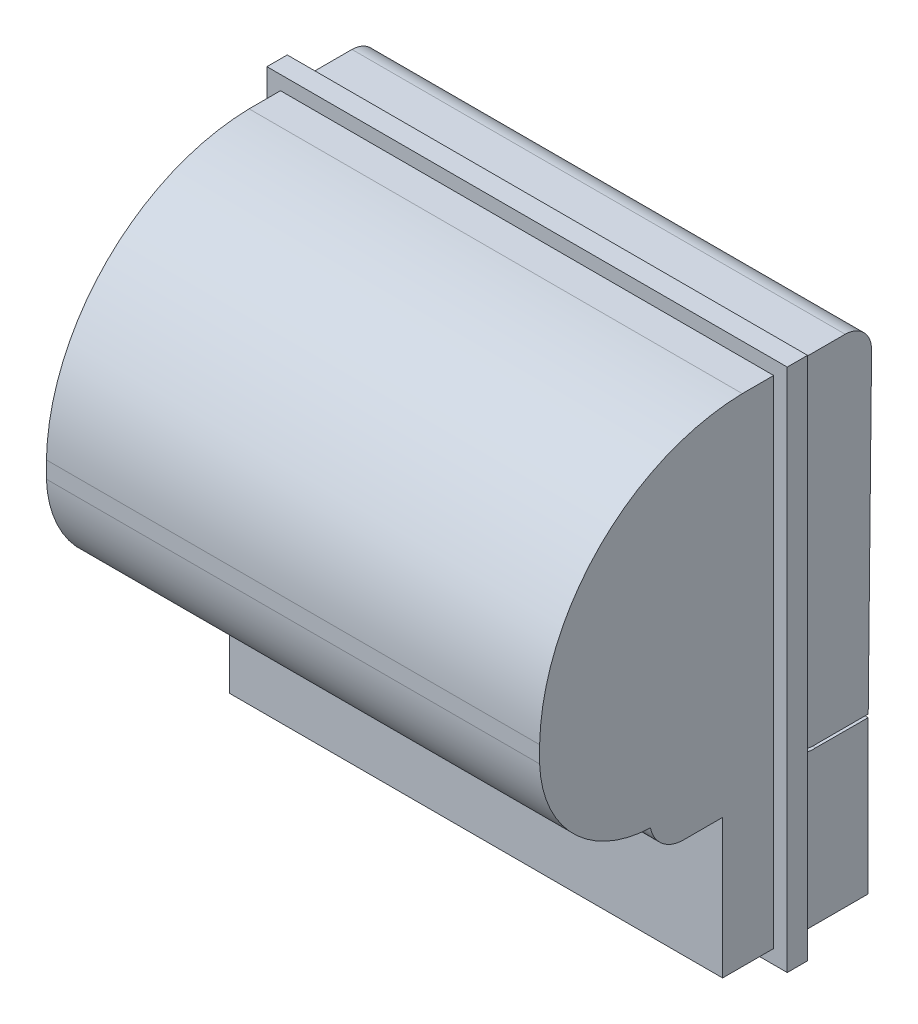
ISO-10303-21;
HEADER;
FILE_DESCRIPTION(('STEP AP214'),'2;1');
FILE_NAME('part.step','',(''),(''),'','','');
FILE_SCHEMA(('AUTOMOTIVE_DESIGN { 1 0 10303 214 1 1 1 1 }'));
ENDSEC;
DATA;
#1=APPLICATION_CONTEXT('core data for automotive mechanical design processes');
#2=APPLICATION_PROTOCOL_DEFINITION('international standard','automotive_design',2000,#1);
#3=PRODUCT_CONTEXT('',#1,'mechanical');
#4=PRODUCT('Part','Part','',(#3));
#5=PRODUCT_RELATED_PRODUCT_CATEGORY('part','',(#4));
#6=PRODUCT_DEFINITION_FORMATION('','',#4);
#7=PRODUCT_DEFINITION_CONTEXT('part definition',#1,'design');
#8=PRODUCT_DEFINITION('design','',#6,#7);
#9=PRODUCT_DEFINITION_SHAPE('','',#8);
#10=(LENGTH_UNIT() NAMED_UNIT(*) SI_UNIT(.MILLI.,.METRE.));
#11=(NAMED_UNIT(*) PLANE_ANGLE_UNIT() SI_UNIT($,.RADIAN.));
#12=(NAMED_UNIT(*) SI_UNIT($,.STERADIAN.) SOLID_ANGLE_UNIT());
#13=UNCERTAINTY_MEASURE_WITH_UNIT(LENGTH_MEASURE(1.E-05),#10,'distance_accuracy_value','');
#14=(GEOMETRIC_REPRESENTATION_CONTEXT(3) GLOBAL_UNCERTAINTY_ASSIGNED_CONTEXT((#13)) GLOBAL_UNIT_ASSIGNED_CONTEXT((#10,
#11,#12)) REPRESENTATION_CONTEXT('',''));
#15=CARTESIAN_POINT('',(0.,0.,0.));
#16=DIRECTION('',(0.,0.,1.));
#17=DIRECTION('',(1.,0.,0.));
#18=AXIS2_PLACEMENT_3D('',#15,#16,#17);
#19=CARTESIAN_POINT('',(2.,75.325,3.));
#20=DIRECTION('',(1.,0.,0.));
#21=DIRECTION('',(0.,1.,0.));
#22=AXIS2_PLACEMENT_3D('',#19,#20,#21);
#23=PLANE('',#22);
#24=DIRECTION('',(0.,0.,1.));
#25=VECTOR('',#24,1.);
#26=CARTESIAN_POINT('',(1.99999999999999,25.0692746241975,3.));
#27=LINE('',#26,#25);
#28=CARTESIAN_POINT('',(2.,25.0692746241975,-10.95));
#29=VERTEX_POINT('',#28);
#30=CARTESIAN_POINT('',(1.99999999999999,25.0692746241975,-3.15989359439703));
#31=VERTEX_POINT('',#30);
#32=EDGE_CURVE('E422',#29,#31,#27,.T.);
#33=ORIENTED_EDGE('',*,*,#32,.T.);
#34=CARTESIAN_POINT('',(1.99999999999999,27.9292641597328,-2.85998953553529));
#35=DIRECTION('',(1.,0.,0.));
#36=DIRECTION('',(0.,1.,0.));
#37=AXIS2_PLACEMENT_3D('',#34,#35,#36);
#38=CIRCLE('',#37,2.87567080659333);
#39=CARTESIAN_POINT('',(1.99999999999999,27.6293601008711,0.));
#40=VERTEX_POINT('',#39);
#41=EDGE_CURVE('E429',#31,#40,#38,.F.);
#42=ORIENTED_EDGE('',*,*,#41,.T.);
#43=DIRECTION('',(0.,-1.,0.));
#44=VECTOR('',#43,1.);
#45=CARTESIAN_POINT('',(2.,75.325,0.));
#46=LINE('',#45,#44);
#47=CARTESIAN_POINT('',(2.,75.325,0.));
#48=VERTEX_POINT('',#47);
#49=EDGE_CURVE('E335',#48,#40,#46,.T.);
#50=ORIENTED_EDGE('',*,*,#49,.F.);
#51=DIRECTION('',(0.,0.,1.));
#52=VECTOR('',#51,1.);
#53=CARTESIAN_POINT('',(2.,75.325,3.));
#54=LINE('',#53,#52);
#55=CARTESIAN_POINT('',(2.,75.325,-7.55257920179949));
#56=VERTEX_POINT('',#55);
#57=EDGE_CURVE('E313',#56,#48,#54,.T.);
#58=ORIENTED_EDGE('',*,*,#57,.F.);
#59=CARTESIAN_POINT('',(2.,71.3761728785547,-7.50117287855473));
#60=DIRECTION('',(1.,0.,0.));
#61=DIRECTION('',(0.,1.,0.));
#62=AXIS2_PLACEMENT_3D('',#59,#60,#61);
#63=CIRCLE('',#62,3.94916171422891);
#64=CARTESIAN_POINT('',(2.,71.4275792017999,-11.45));
#65=VERTEX_POINT('',#64);
#66=EDGE_CURVE('E123',#56,#65,#63,.F.);
#67=ORIENTED_EDGE('',*,*,#66,.T.);
#68=DIRECTION('',(0.,-0.999941840985945,0.0107849267795385));
#69=VECTOR('',#68,1.);
#70=CARTESIAN_POINT('',(2.,75.1687135445449,-11.4903502066872));
#71=LINE('',#70,#69);
#72=EDGE_CURVE('E275',#65,#29,#71,.T.);
#73=ORIENTED_EDGE('',*,*,#72,.T.);
#74=EDGE_LOOP('',(#33,#42,#50,#58,#67,#73));
#75=FACE_BOUND('',#74,.T.);
#76=ADVANCED_FACE('F108',(#75),#23,.F.);
#77=CARTESIAN_POINT('',(74.8,75.325,3.));
#78=DIRECTION('',(-1.,0.,0.));
#79=DIRECTION('',(0.,0.,1.));
#80=AXIS2_PLACEMENT_3D('',#77,#78,#79);
#81=PLANE('',#80);
#82=DIRECTION('',(0.,1.,0.));
#83=VECTOR('',#82,1.);
#84=CARTESIAN_POINT('',(74.8,75.325,0.));
#85=LINE('',#84,#83);
#86=CARTESIAN_POINT('',(74.8,27.6293601008711,0.));
#87=VERTEX_POINT('',#86);
#88=CARTESIAN_POINT('',(74.8,75.325,0.));
#89=VERTEX_POINT('',#88);
#90=EDGE_CURVE('E341',#87,#89,#85,.T.);
#91=ORIENTED_EDGE('',*,*,#90,.F.);
#92=CARTESIAN_POINT('',(74.8,27.9292641597328,-2.85998953553529));
#93=DIRECTION('',(-1.,0.,0.));
#94=DIRECTION('',(0.,0.,1.));
#95=AXIS2_PLACEMENT_3D('',#92,#93,#94);
#96=CIRCLE('',#95,2.87567080659333);
#97=CARTESIAN_POINT('',(74.8,25.0692746241975,-3.15989359439703));
#98=VERTEX_POINT('',#97);
#99=EDGE_CURVE('E12',#87,#98,#96,.F.);
#100=ORIENTED_EDGE('',*,*,#99,.T.);
#101=DIRECTION('',(0.,0.,-1.));
#102=VECTOR('',#101,1.);
#103=CARTESIAN_POINT('',(74.8,25.0692746241975,3.));
#104=LINE('',#103,#102);
#105=CARTESIAN_POINT('',(74.8,25.0692746241975,-10.95));
#106=VERTEX_POINT('',#105);
#107=EDGE_CURVE('E116',#98,#106,#104,.T.);
#108=ORIENTED_EDGE('',*,*,#107,.T.);
#109=DIRECTION('',(0.,0.999941840985945,-0.0107849267795385));
#110=VECTOR('',#109,1.);
#111=CARTESIAN_POINT('',(74.8,75.1687135445449,-11.4903502066872));
#112=LINE('',#111,#110);
#113=CARTESIAN_POINT('',(74.8,71.4275792017999,-11.45));
#114=VERTEX_POINT('',#113);
#115=EDGE_CURVE('E272',#106,#114,#112,.T.);
#116=ORIENTED_EDGE('',*,*,#115,.T.);
#117=CARTESIAN_POINT('',(74.8,71.3761728785547,-7.50117287855473));
#118=DIRECTION('',(-1.,0.,0.));
#119=DIRECTION('',(0.,0.,1.));
#120=AXIS2_PLACEMENT_3D('',#117,#118,#119);
#121=CIRCLE('',#120,3.94916171422891);
#122=CARTESIAN_POINT('',(74.8,75.325,-7.55257920179949));
#123=VERTEX_POINT('',#122);
#124=EDGE_CURVE('E286',#114,#123,#121,.F.);
#125=ORIENTED_EDGE('',*,*,#124,.T.);
#126=DIRECTION('',(0.,0.,1.));
#127=VECTOR('',#126,1.);
#128=CARTESIAN_POINT('',(74.8,75.325,3.));
#129=LINE('',#128,#127);
#130=EDGE_CURVE('E306',#123,#89,#129,.T.);
#131=ORIENTED_EDGE('',*,*,#130,.T.);
#132=EDGE_LOOP('',(#91,#100,#108,#116,#125,#131));
#133=FACE_BOUND('',#132,.T.);
#134=ADVANCED_FACE('F284',(#133),#81,.F.);
#135=CARTESIAN_POINT('',(-86.1281027822567,75.325,3.));
#136=DIRECTION('',(0.,-1.,0.));
#137=DIRECTION('',(0.,0.,-1.));
#138=AXIS2_PLACEMENT_3D('',#135,#136,#137);
#139=PLANE('',#138);
#140=DIRECTION('',(1.,0.,0.));
#141=VECTOR('',#140,1.);
#142=CARTESIAN_POINT('',(1.9,75.325,7.63398030725368));
#143=LINE('',#142,#141);
#144=CARTESIAN_POINT('',(2.,75.325,7.63398030725368));
#145=VERTEX_POINT('',#144);
#146=CARTESIAN_POINT('',(74.8,75.325,7.63398030725368));
#147=VERTEX_POINT('',#146);
#148=EDGE_CURVE('E447',#145,#147,#143,.T.);
#149=ORIENTED_EDGE('',*,*,#148,.T.);
#150=CARTESIAN_POINT('',(74.8,75.325,3.));
#151=VERTEX_POINT('',#150);
#152=EDGE_CURVE('E305',#151,#147,#129,.T.);
#153=ORIENTED_EDGE('',*,*,#152,.F.);
#154=DIRECTION('',(-1.,0.,0.));
#155=VECTOR('',#154,1.);
#156=CARTESIAN_POINT('',(2.,75.325,3.));
#157=LINE('',#156,#155);
#158=CARTESIAN_POINT('',(2.,75.325,3.));
#159=VERTEX_POINT('',#158);
#160=EDGE_CURVE('E318',#151,#159,#157,.T.);
#161=ORIENTED_EDGE('',*,*,#160,.T.);
#162=EDGE_CURVE('E308',#159,#145,#54,.T.);
#163=ORIENTED_EDGE('',*,*,#162,.T.);
#164=EDGE_LOOP('',(#149,#153,#161,#163));
#165=FACE_BOUND('',#164,.T.);
#166=ADVANCED_FACE('F487',(#165),#139,.F.);
#167=CARTESIAN_POINT('',(-86.1281027822567,75.325,37.55));
#168=DIRECTION('',(0.,0.,-1.));
#169=DIRECTION('',(-1.,0.,0.));
#170=AXIS2_PLACEMENT_3D('',#167,#168,#169);
#171=PLANE('',#170);
#172=DIRECTION('',(1.,0.,0.));
#173=VECTOR('',#172,1.);
#174=CARTESIAN_POINT('',(1.9,42.9459734266411,37.55));
#175=LINE('',#174,#173);
#176=CARTESIAN_POINT('',(1.99999999999999,42.9459734266411,37.55));
#177=VERTEX_POINT('',#176);
#178=CARTESIAN_POINT('',(74.8,42.9459734266411,37.55));
#179=VERTEX_POINT('',#178);
#180=EDGE_CURVE('E277',#177,#179,#175,.T.);
#181=ORIENTED_EDGE('',*,*,#180,.T.);
#182=DIRECTION('',(0.,-1.,0.));
#183=VECTOR('',#182,1.);
#184=CARTESIAN_POINT('',(74.8,75.325,37.55));
#185=LINE('',#184,#183);
#186=CARTESIAN_POINT('',(74.8,45.4089803072521,37.55));
#187=VERTEX_POINT('',#186);
#188=EDGE_CURVE('E302',#187,#179,#185,.T.);
#189=ORIENTED_EDGE('',*,*,#188,.F.);
#190=DIRECTION('',(1.,0.,0.));
#191=VECTOR('',#190,1.);
#192=CARTESIAN_POINT('',(1.9,45.4089803072521,37.55));
#193=LINE('',#192,#191);
#194=CARTESIAN_POINT('',(2.,45.4089803072521,37.55));
#195=VERTEX_POINT('',#194);
#196=EDGE_CURVE('E444',#195,#187,#193,.T.);
#197=ORIENTED_EDGE('',*,*,#196,.F.);
#198=DIRECTION('',(0.,-1.,0.));
#199=VECTOR('',#198,1.);
#200=CARTESIAN_POINT('',(2.,75.325,37.55));
#201=LINE('',#200,#199);
#202=EDGE_CURVE('E309',#195,#177,#201,.T.);
#203=ORIENTED_EDGE('',*,*,#202,.T.);
#204=EDGE_LOOP('',(#181,#189,#197,#203));
#205=FACE_BOUND('',#204,.T.);
#206=ADVANCED_FACE('F496',(#205),#171,.F.);
#207=CARTESIAN_POINT('',(-86.1281027822567,2.07500000000001,37.55));
#208=DIRECTION('',(0.,1.,0.));
#209=DIRECTION('',(0.,0.,1.));
#210=AXIS2_PLACEMENT_3D('',#207,#208,#209);
#211=PLANE('',#210);
#212=DIRECTION('',(1.,0.,0.));
#213=VECTOR('',#212,1.);
#214=CARTESIAN_POINT('',(1.9,2.07500000000001,10.540023280775));
#215=LINE('',#214,#213);
#216=CARTESIAN_POINT('',(1.99999999999999,2.07500000000001,10.540023280775));
#217=VERTEX_POINT('',#216);
#218=CARTESIAN_POINT('',(74.8,2.07500000000001,10.540023280775));
#219=VERTEX_POINT('',#218);
#220=EDGE_CURVE('E131',#217,#219,#215,.T.);
#221=ORIENTED_EDGE('',*,*,#220,.F.);
#222=DIRECTION('',(0.,0.,-1.));
#223=VECTOR('',#222,1.);
#224=CARTESIAN_POINT('',(2.,2.07500000000001,37.55));
#225=LINE('',#224,#223);
#226=CARTESIAN_POINT('',(1.99999999999999,2.07500000000001,3.));
#227=VERTEX_POINT('',#226);
#228=EDGE_CURVE('E314',#217,#227,#225,.T.);
#229=ORIENTED_EDGE('',*,*,#228,.T.);
#230=DIRECTION('',(1.,0.,0.));
#231=VECTOR('',#230,1.);
#232=CARTESIAN_POINT('',(74.8,2.07500000000001,3.));
#233=LINE('',#232,#231);
#234=CARTESIAN_POINT('',(74.8,2.07500000000001,3.));
#235=VERTEX_POINT('',#234);
#236=EDGE_CURVE('E325',#227,#235,#233,.T.);
#237=ORIENTED_EDGE('',*,*,#236,.T.);
#238=DIRECTION('',(0.,0.,-1.));
#239=VECTOR('',#238,1.);
#240=CARTESIAN_POINT('',(74.8,2.07500000000001,37.55));
#241=LINE('',#240,#239);
#242=EDGE_CURVE('E300',#219,#235,#241,.T.);
#243=ORIENTED_EDGE('',*,*,#242,.F.);
#244=EDGE_LOOP('',(#221,#229,#237,#243));
#245=FACE_BOUND('',#244,.T.);
#246=ADVANCED_FACE('F474',(#245),#211,.F.);
#247=CARTESIAN_POINT('',(2.,43.5560509384181,20.5854366719097));
#248=DIRECTION('',(1.,0.,0.));
#249=DIRECTION('',(0.,1.,0.));
#250=AXIS2_PLACEMENT_3D('',#247,#248,#249);
#251=CIRCLE('',#250,16.975529549418);
#252=CARTESIAN_POINT('',(1.99999999999999,26.5914876103277,21.1955141836866));
#253=VERTEX_POINT('',#252);
#254=EDGE_CURVE('E292',#177,#253,#251,.T.);
#255=ORIENTED_EDGE('',*,*,#254,.F.);
#256=ORIENTED_EDGE('',*,*,#202,.F.);
#257=CARTESIAN_POINT('',(2.,44.7875543787235,7.01255437872351));
#258=DIRECTION('',(1.,0.,0.));
#259=DIRECTION('',(0.,1.,0.));
#260=AXIS2_PLACEMENT_3D('',#257,#258,#259);
#261=CIRCLE('',#260,30.5437678628074);
#262=EDGE_CURVE('E450',#145,#195,#261,.T.);
#263=ORIENTED_EDGE('',*,*,#262,.F.);
#264=ORIENTED_EDGE('',*,*,#162,.F.);
#265=DIRECTION('',(0.,-1.,0.));
#266=VECTOR('',#265,1.);
#267=CARTESIAN_POINT('',(2.,75.325,3.));
#268=LINE('',#267,#266);
#269=EDGE_CURVE('E321',#159,#227,#268,.T.);
#270=ORIENTED_EDGE('',*,*,#269,.T.);
#271=ORIENTED_EDGE('',*,*,#228,.F.);
#272=DIRECTION('',(0.,-1.,0.));
#273=VECTOR('',#272,1.);
#274=CARTESIAN_POINT('',(2.,75.325,10.540023280775));
#275=LINE('',#274,#273);
#276=CARTESIAN_POINT('',(1.99999999999999,22.608326020261,10.540023280775));
#277=VERTEX_POINT('',#276);
#278=EDGE_CURVE('E452',#277,#217,#275,.T.);
#279=ORIENTED_EDGE('',*,*,#278,.F.);
#280=DIRECTION('',(0.,0.,-1.));
#281=VECTOR('',#280,1.);
#282=CARTESIAN_POINT('',(1.99999999999999,22.608326020261,3.));
#283=LINE('',#282,#281);
#284=CARTESIAN_POINT('',(1.99999999999999,22.608326020261,16.2829177284482));
#285=VERTEX_POINT('',#284);
#286=EDGE_CURVE('E454',#285,#277,#283,.T.);
#287=ORIENTED_EDGE('',*,*,#286,.F.);
#288=CARTESIAN_POINT('',(1.99999999999999,27.6293601008711,16.2829177284482));
#289=DIRECTION('',(1.,0.,0.));
#290=DIRECTION('',(0.,1.,0.));
#291=AXIS2_PLACEMENT_3D('',#288,#289,#290);
#292=CIRCLE('',#291,5.0210340806101);
#293=EDGE_CURVE('E296',#253,#285,#292,.T.);
#294=ORIENTED_EDGE('',*,*,#293,.F.);
#295=EDGE_LOOP('',(#255,#256,#263,#264,#270,#271,#279,#287,#294));
#296=FACE_BOUND('',#295,.T.);
#297=ADVANCED_FACE('F469',(#296),#23,.F.);
#298=CARTESIAN_POINT('',(74.8,43.5560509384181,20.5854366719097));
#299=DIRECTION('',(-1.,0.,0.));
#300=DIRECTION('',(0.,0.,1.));
#301=AXIS2_PLACEMENT_3D('',#298,#299,#300);
#302=CIRCLE('',#301,16.975529549418);
#303=CARTESIAN_POINT('',(74.8,26.5914876103277,21.1955141836866));
#304=VERTEX_POINT('',#303);
#305=EDGE_CURVE('E381',#304,#179,#302,.T.);
#306=ORIENTED_EDGE('',*,*,#305,.F.);
#307=CARTESIAN_POINT('',(74.8,27.6293601008711,16.2829177284482));
#308=DIRECTION('',(-1.,0.,0.));
#309=DIRECTION('',(0.,0.,1.));
#310=AXIS2_PLACEMENT_3D('',#307,#308,#309);
#311=CIRCLE('',#310,5.0210340806101);
#312=CARTESIAN_POINT('',(74.8,22.608326020261,16.2829177284482));
#313=VERTEX_POINT('',#312);
#314=EDGE_CURVE('E379',#313,#304,#311,.T.);
#315=ORIENTED_EDGE('',*,*,#314,.F.);
#316=DIRECTION('',(0.,0.,1.));
#317=VECTOR('',#316,1.);
#318=CARTESIAN_POINT('',(74.8,22.608326020261,3.));
#319=LINE('',#318,#317);
#320=CARTESIAN_POINT('',(74.8,22.608326020261,10.540023280775));
#321=VERTEX_POINT('',#320);
#322=EDGE_CURVE('E377',#321,#313,#319,.T.);
#323=ORIENTED_EDGE('',*,*,#322,.F.);
#324=DIRECTION('',(0.,1.,0.));
#325=VECTOR('',#324,1.);
#326=CARTESIAN_POINT('',(74.8,75.325,10.540023280775));
#327=LINE('',#326,#325);
#328=EDGE_CURVE('E375',#219,#321,#327,.T.);
#329=ORIENTED_EDGE('',*,*,#328,.F.);
#330=ORIENTED_EDGE('',*,*,#242,.T.);
#331=DIRECTION('',(0.,1.,0.));
#332=VECTOR('',#331,1.);
#333=CARTESIAN_POINT('',(74.8,75.325,3.));
#334=LINE('',#333,#332);
#335=EDGE_CURVE('E328',#235,#151,#334,.T.);
#336=ORIENTED_EDGE('',*,*,#335,.T.);
#337=ORIENTED_EDGE('',*,*,#152,.T.);
#338=CARTESIAN_POINT('',(74.8,44.7875543787235,7.01255437872351));
#339=DIRECTION('',(-1.,0.,0.));
#340=DIRECTION('',(0.,0.,1.));
#341=AXIS2_PLACEMENT_3D('',#338,#339,#340);
#342=CIRCLE('',#341,30.5437678628074);
#343=EDGE_CURVE('E373',#187,#147,#342,.T.);
#344=ORIENTED_EDGE('',*,*,#343,.F.);
#345=ORIENTED_EDGE('',*,*,#188,.T.);
#346=EDGE_LOOP('',(#306,#315,#323,#329,#330,#336,#337,#344,#345));
#347=FACE_BOUND('',#346,.T.);
#348=ADVANCED_FACE('F479',(#347),#81,.F.);
#349=CARTESIAN_POINT('',(0.,0.,3.));
#350=DIRECTION('',(0.,0.,1.));
#351=DIRECTION('',(1.,0.,0.));
#352=AXIS2_PLACEMENT_3D('',#349,#350,#351);
#353=PLANE('',#352);
#354=DIRECTION('',(0.,-1.,0.));
#355=VECTOR('',#354,1.);
#356=CARTESIAN_POINT('',(0.,77.4,3.));
#357=LINE('',#356,#355);
#358=CARTESIAN_POINT('',(0.,77.4,3.));
#359=VERTEX_POINT('',#358);
#360=CARTESIAN_POINT('',(0.,0.,3.));
#361=VERTEX_POINT('',#360);
#362=EDGE_CURVE('E344',#359,#361,#357,.T.);
#363=ORIENTED_EDGE('',*,*,#362,.T.);
#364=DIRECTION('',(1.,0.,0.));
#365=VECTOR('',#364,1.);
#366=CARTESIAN_POINT('',(0.,0.,3.));
#367=LINE('',#366,#365);
#368=CARTESIAN_POINT('',(76.8,0.,3.));
#369=VERTEX_POINT('',#368);
#370=EDGE_CURVE('E347',#361,#369,#367,.T.);
#371=ORIENTED_EDGE('',*,*,#370,.T.);
#372=DIRECTION('',(0.,1.,0.));
#373=VECTOR('',#372,1.);
#374=CARTESIAN_POINT('',(76.8,0.,3.));
#375=LINE('',#374,#373);
#376=CARTESIAN_POINT('',(76.8,77.4,3.));
#377=VERTEX_POINT('',#376);
#378=EDGE_CURVE('E350',#369,#377,#375,.T.);
#379=ORIENTED_EDGE('',*,*,#378,.T.);
#380=DIRECTION('',(-1.,0.,0.));
#381=VECTOR('',#380,1.);
#382=CARTESIAN_POINT('',(76.8,77.4,3.));
#383=LINE('',#382,#381);
#384=EDGE_CURVE('E352',#377,#359,#383,.T.);
#385=ORIENTED_EDGE('',*,*,#384,.T.);
#386=EDGE_LOOP('',(#363,#371,#379,#385));
#387=FACE_BOUND('',#386,.T.);
#388=ORIENTED_EDGE('',*,*,#269,.F.);
#389=ORIENTED_EDGE('',*,*,#160,.F.);
#390=ORIENTED_EDGE('',*,*,#335,.F.);
#391=ORIENTED_EDGE('',*,*,#236,.F.);
#392=EDGE_LOOP('',(#388,#389,#390,#391));
#393=FACE_BOUND('',#392,.T.);
#394=ADVANCED_FACE('F483',(#387,#393),#353,.T.);
#395=CARTESIAN_POINT('',(0.,0.,0.));
#396=DIRECTION('',(0.,0.,1.));
#397=DIRECTION('',(1.,0.,0.));
#398=AXIS2_PLACEMENT_3D('',#395,#396,#397);
#399=PLANE('',#398);
#400=DIRECTION('',(1.,0.,0.));
#401=VECTOR('',#400,1.);
#402=CARTESIAN_POINT('',(1.9,27.1293601008711,0.));
#403=LINE('',#402,#401);
#404=CARTESIAN_POINT('',(1.99999999999999,27.1293601008711,0.));
#405=VERTEX_POINT('',#404);
#406=CARTESIAN_POINT('',(74.8,27.1293601008711,0.));
#407=VERTEX_POINT('',#406);
#408=EDGE_CURVE('E288',#405,#407,#403,.T.);
#409=ORIENTED_EDGE('',*,*,#408,.F.);
#410=CARTESIAN_POINT('',(2.,2.07500000000001,0.));
#411=VERTEX_POINT('',#410);
#412=EDGE_CURVE('E334',#405,#411,#46,.T.);
#413=ORIENTED_EDGE('',*,*,#412,.T.);
#414=DIRECTION('',(1.,0.,0.));
#415=VECTOR('',#414,1.);
#416=CARTESIAN_POINT('',(74.8,2.07500000000001,0.));
#417=LINE('',#416,#415);
#418=CARTESIAN_POINT('',(74.8,2.07500000000001,0.));
#419=VERTEX_POINT('',#418);
#420=EDGE_CURVE('E338',#411,#419,#417,.T.);
#421=ORIENTED_EDGE('',*,*,#420,.T.);
#422=EDGE_CURVE('E322',#419,#407,#85,.T.);
#423=ORIENTED_EDGE('',*,*,#422,.T.);
#424=EDGE_LOOP('',(#409,#413,#421,#423));
#425=FACE_BOUND('',#424,.T.);
#426=DIRECTION('',(1.,0.,0.));
#427=VECTOR('',#426,1.);
#428=CARTESIAN_POINT('',(1.9,27.6293601008711,0.));
#429=LINE('',#428,#427);
#430=EDGE_CURVE('E579',#40,#87,#429,.T.);
#431=ORIENTED_EDGE('',*,*,#430,.T.);
#432=ORIENTED_EDGE('',*,*,#90,.T.);
#433=DIRECTION('',(-1.,0.,0.));
#434=VECTOR('',#433,1.);
#435=CARTESIAN_POINT('',(2.,75.325,0.));
#436=LINE('',#435,#434);
#437=EDGE_CURVE('E316',#89,#48,#436,.T.);
#438=ORIENTED_EDGE('',*,*,#437,.T.);
#439=ORIENTED_EDGE('',*,*,#49,.T.);
#440=EDGE_LOOP('',(#431,#432,#438,#439));
#441=FACE_BOUND('',#440,.T.);
#442=DIRECTION('',(0.,-1.,0.));
#443=VECTOR('',#442,1.);
#444=CARTESIAN_POINT('',(0.,77.4,0.));
#445=LINE('',#444,#443);
#446=CARTESIAN_POINT('',(0.,77.4,0.));
#447=VERTEX_POINT('',#446);
#448=CARTESIAN_POINT('',(0.,0.,0.));
#449=VERTEX_POINT('',#448);
#450=EDGE_CURVE('E331',#447,#449,#445,.T.);
#451=ORIENTED_EDGE('',*,*,#450,.F.);
#452=DIRECTION('',(-1.,0.,0.));
#453=VECTOR('',#452,1.);
#454=CARTESIAN_POINT('',(76.8,77.4,0.));
#455=LINE('',#454,#453);
#456=CARTESIAN_POINT('',(76.8,77.4,0.));
#457=VERTEX_POINT('',#456);
#458=EDGE_CURVE('E348',#457,#447,#455,.T.);
#459=ORIENTED_EDGE('',*,*,#458,.F.);
#460=DIRECTION('',(0.,1.,0.));
#461=VECTOR('',#460,1.);
#462=CARTESIAN_POINT('',(76.8,0.,0.));
#463=LINE('',#462,#461);
#464=CARTESIAN_POINT('',(76.8,0.,0.));
#465=VERTEX_POINT('',#464);
#466=EDGE_CURVE('E359',#465,#457,#463,.T.);
#467=ORIENTED_EDGE('',*,*,#466,.F.);
#468=DIRECTION('',(1.,0.,0.));
#469=VECTOR('',#468,1.);
#470=CARTESIAN_POINT('',(0.,0.,0.));
#471=LINE('',#470,#469);
#472=EDGE_CURVE('E357',#449,#465,#471,.T.);
#473=ORIENTED_EDGE('',*,*,#472,.F.);
#474=EDGE_LOOP('',(#451,#459,#467,#473));
#475=FACE_BOUND('',#474,.T.);
#476=ADVANCED_FACE('F402',(#425,#441,#475),#399,.F.);
#477=CARTESIAN_POINT('',(0.,77.4,3.));
#478=DIRECTION('',(1.,0.,0.));
#479=DIRECTION('',(0.,0.,-1.));
#480=AXIS2_PLACEMENT_3D('',#477,#478,#479);
#481=PLANE('',#480);
#482=ORIENTED_EDGE('',*,*,#450,.T.);
#483=DIRECTION('',(0.,0.,-1.));
#484=VECTOR('',#483,1.);
#485=CARTESIAN_POINT('',(0.,0.,3.));
#486=LINE('',#485,#484);
#487=EDGE_CURVE('E370',#361,#449,#486,.T.);
#488=ORIENTED_EDGE('',*,*,#487,.F.);
#489=ORIENTED_EDGE('',*,*,#362,.F.);
#490=DIRECTION('',(0.,0.,-1.));
#491=VECTOR('',#490,1.);
#492=CARTESIAN_POINT('',(0.,77.4,3.));
#493=LINE('',#492,#491);
#494=EDGE_CURVE('E354',#359,#447,#493,.T.);
#495=ORIENTED_EDGE('',*,*,#494,.T.);
#496=EDGE_LOOP('',(#482,#488,#489,#495));
#497=FACE_BOUND('',#496,.T.);
#498=ADVANCED_FACE('F110',(#497),#481,.F.);
#499=CARTESIAN_POINT('',(0.,0.,3.));
#500=DIRECTION('',(0.,1.,0.));
#501=DIRECTION('',(0.,0.,1.));
#502=AXIS2_PLACEMENT_3D('',#499,#500,#501);
#503=PLANE('',#502);
#504=ORIENTED_EDGE('',*,*,#472,.T.);
#505=DIRECTION('',(0.,0.,-1.));
#506=VECTOR('',#505,1.);
#507=CARTESIAN_POINT('',(76.8,0.,3.));
#508=LINE('',#507,#506);
#509=EDGE_CURVE('E367',#369,#465,#508,.T.);
#510=ORIENTED_EDGE('',*,*,#509,.F.);
#511=ORIENTED_EDGE('',*,*,#370,.F.);
#512=ORIENTED_EDGE('',*,*,#487,.T.);
#513=EDGE_LOOP('',(#504,#510,#511,#512));
#514=FACE_BOUND('',#513,.T.);
#515=ADVANCED_FACE('F604',(#514),#503,.F.);
#516=CARTESIAN_POINT('',(76.8,0.,3.));
#517=DIRECTION('',(-1.,0.,0.));
#518=DIRECTION('',(0.,0.,1.));
#519=AXIS2_PLACEMENT_3D('',#516,#517,#518);
#520=PLANE('',#519);
#521=ORIENTED_EDGE('',*,*,#466,.T.);
#522=DIRECTION('',(0.,0.,-1.));
#523=VECTOR('',#522,1.);
#524=CARTESIAN_POINT('',(76.8,77.4,3.));
#525=LINE('',#524,#523);
#526=EDGE_CURVE('E364',#377,#457,#525,.T.);
#527=ORIENTED_EDGE('',*,*,#526,.F.);
#528=ORIENTED_EDGE('',*,*,#378,.F.);
#529=ORIENTED_EDGE('',*,*,#509,.T.);
#530=EDGE_LOOP('',(#521,#527,#528,#529));
#531=FACE_BOUND('',#530,.T.);
#532=ADVANCED_FACE('F601',(#531),#520,.F.);
#533=CARTESIAN_POINT('',(76.8,77.4,3.));
#534=DIRECTION('',(0.,-1.,0.));
#535=DIRECTION('',(0.,0.,-1.));
#536=AXIS2_PLACEMENT_3D('',#533,#534,#535);
#537=PLANE('',#536);
#538=ORIENTED_EDGE('',*,*,#458,.T.);
#539=ORIENTED_EDGE('',*,*,#494,.F.);
#540=ORIENTED_EDGE('',*,*,#384,.F.);
#541=ORIENTED_EDGE('',*,*,#526,.T.);
#542=EDGE_LOOP('',(#538,#539,#540,#541));
#543=FACE_BOUND('',#542,.T.);
#544=ADVANCED_FACE('F518',(#543),#537,.F.);
#545=ORIENTED_EDGE('',*,*,#412,.F.);
#546=CARTESIAN_POINT('',(1.99999999999999,27.4618965789319,-2.82735711633616));
#547=DIRECTION('',(1.,0.,0.));
#548=DIRECTION('',(0.,1.,0.));
#549=AXIS2_PLACEMENT_3D('',#546,#547,#548);
#550=CIRCLE('',#549,2.8468454072074);
#551=CARTESIAN_POINT('',(1.99999999999999,24.6345394625958,-3.15989359439703));
#552=VERTEX_POINT('',#551);
#553=EDGE_CURVE('E278',#405,#552,#550,.T.);
#554=ORIENTED_EDGE('',*,*,#553,.T.);
#555=DIRECTION('',(0.,-0.00250166414609072,-0.999996870833354));
#556=VECTOR('',#555,1.);
#557=CARTESIAN_POINT('',(1.99999999999999,24.6502666366246,3.1267715602572));
#558=LINE('',#557,#556);
#559=CARTESIAN_POINT('',(1.99999999999999,24.6150511717246,-10.95));
#560=VERTEX_POINT('',#559);
#561=EDGE_CURVE('E416',#552,#560,#558,.T.);
#562=ORIENTED_EDGE('',*,*,#561,.T.);
#563=DIRECTION('',(0.,-1.,0.));
#564=VECTOR('',#563,1.);
#565=CARTESIAN_POINT('',(2.,75.325,-10.95));
#566=LINE('',#565,#564);
#567=CARTESIAN_POINT('',(2.,2.07500000000001,-10.95));
#568=VERTEX_POINT('',#567);
#569=EDGE_CURVE('E415',#560,#568,#566,.T.);
#570=ORIENTED_EDGE('',*,*,#569,.T.);
#571=EDGE_CURVE('E312',#411,#568,#225,.T.);
#572=ORIENTED_EDGE('',*,*,#571,.F.);
#573=EDGE_LOOP('',(#545,#554,#562,#570,#572));
#574=FACE_BOUND('',#573,.T.);
#575=ADVANCED_FACE('F412',(#574),#23,.F.);
#576=DIRECTION('',(0.,0.00250166414609072,0.999996870833354));
#577=VECTOR('',#576,1.);
#578=CARTESIAN_POINT('',(74.8,24.6502666366246,3.1267715602572));
#579=LINE('',#578,#577);
#580=CARTESIAN_POINT('',(74.8,24.6150511717246,-10.95));
#581=VERTEX_POINT('',#580);
#582=CARTESIAN_POINT('',(74.8,24.6345394625958,-3.15989359439703));
#583=VERTEX_POINT('',#582);
#584=EDGE_CURVE('E387',#581,#583,#579,.T.);
#585=ORIENTED_EDGE('',*,*,#584,.T.);
#586=CARTESIAN_POINT('',(74.8,27.4618965789319,-2.82735711633616));
#587=DIRECTION('',(-1.,0.,0.));
#588=DIRECTION('',(0.,0.,1.));
#589=AXIS2_PLACEMENT_3D('',#586,#587,#588);
#590=CIRCLE('',#589,2.8468454072074);
#591=EDGE_CURVE('E390',#583,#407,#590,.T.);
#592=ORIENTED_EDGE('',*,*,#591,.T.);
#593=ORIENTED_EDGE('',*,*,#422,.F.);
#594=CARTESIAN_POINT('',(74.8,2.07500000000001,-10.95));
#595=VERTEX_POINT('',#594);
#596=EDGE_CURVE('E294',#419,#595,#241,.T.);
#597=ORIENTED_EDGE('',*,*,#596,.T.);
#598=DIRECTION('',(0.,1.,0.));
#599=VECTOR('',#598,1.);
#600=CARTESIAN_POINT('',(74.8,75.325,-10.95));
#601=LINE('',#600,#599);
#602=EDGE_CURVE('E420',#595,#581,#601,.T.);
#603=ORIENTED_EDGE('',*,*,#602,.T.);
#604=EDGE_LOOP('',(#585,#592,#593,#597,#603));
#605=FACE_BOUND('',#604,.T.);
#606=ADVANCED_FACE('F393',(#605),#81,.F.);
#607=ORIENTED_EDGE('',*,*,#571,.T.);
#608=DIRECTION('',(1.,0.,0.));
#609=VECTOR('',#608,1.);
#610=CARTESIAN_POINT('',(-86.1281027822567,2.07500000000001,-10.95));
#611=LINE('',#610,#609);
#612=EDGE_CURVE('E384',#568,#595,#611,.T.);
#613=ORIENTED_EDGE('',*,*,#612,.T.);
#614=ORIENTED_EDGE('',*,*,#596,.F.);
#615=ORIENTED_EDGE('',*,*,#420,.F.);
#616=EDGE_LOOP('',(#607,#613,#614,#615));
#617=FACE_BOUND('',#616,.T.);
#618=ADVANCED_FACE('F409',(#617),#211,.F.);
#619=ORIENTED_EDGE('',*,*,#130,.F.);
#620=DIRECTION('',(1.,0.,0.));
#621=VECTOR('',#620,1.);
#622=CARTESIAN_POINT('',(1.9,75.325,-7.55257920179949));
#623=LINE('',#622,#621);
#624=EDGE_CURVE('E291',#123,#56,#623,.F.);
#625=ORIENTED_EDGE('',*,*,#624,.T.);
#626=ORIENTED_EDGE('',*,*,#57,.T.);
#627=ORIENTED_EDGE('',*,*,#437,.F.);
#628=EDGE_LOOP('',(#619,#625,#626,#627));
#629=FACE_BOUND('',#628,.T.);
#630=ADVANCED_FACE('F506',(#629),#139,.F.);
#631=CARTESIAN_POINT('',(1.9,44.7875543787235,7.01255437872351));
#632=DIRECTION('',(1.,0.,0.));
#633=DIRECTION('',(0.,0.,-1.));
#634=AXIS2_PLACEMENT_3D('',#631,#632,#633);
#635=CYLINDRICAL_SURFACE('',#634,30.5437678628074);
#636=ORIENTED_EDGE('',*,*,#262,.T.);
#637=ORIENTED_EDGE('',*,*,#196,.T.);
#638=ORIENTED_EDGE('',*,*,#343,.T.);
#639=ORIENTED_EDGE('',*,*,#148,.F.);
#640=EDGE_LOOP('',(#636,#637,#638,#639));
#641=FACE_BOUND('',#640,.T.);
#642=ADVANCED_FACE('F492',(#641),#635,.T.);
#643=CARTESIAN_POINT('',(1.9,43.5560509384181,20.5854366719097));
#644=DIRECTION('',(1.,0.,0.));
#645=DIRECTION('',(0.,0.,-1.));
#646=AXIS2_PLACEMENT_3D('',#643,#644,#645);
#647=CYLINDRICAL_SURFACE('',#646,16.975529549418);
#648=ORIENTED_EDGE('',*,*,#254,.T.);
#649=DIRECTION('',(1.,0.,0.));
#650=VECTOR('',#649,1.);
#651=CARTESIAN_POINT('',(1.9,26.5914876103277,21.1955141836866));
#652=LINE('',#651,#650);
#653=EDGE_CURVE('E442',#253,#304,#652,.T.);
#654=ORIENTED_EDGE('',*,*,#653,.T.);
#655=ORIENTED_EDGE('',*,*,#305,.T.);
#656=ORIENTED_EDGE('',*,*,#180,.F.);
#657=EDGE_LOOP('',(#648,#654,#655,#656));
#658=FACE_BOUND('',#657,.T.);
#659=ADVANCED_FACE('F498',(#658),#647,.T.);
#660=CARTESIAN_POINT('',(1.9,27.6293601008711,16.2829177284482));
#661=DIRECTION('',(1.,0.,0.));
#662=DIRECTION('',(0.,0.,-1.));
#663=AXIS2_PLACEMENT_3D('',#660,#661,#662);
#664=CYLINDRICAL_SURFACE('',#663,5.0210340806101);
#665=ORIENTED_EDGE('',*,*,#293,.T.);
#666=DIRECTION('',(1.,0.,0.));
#667=VECTOR('',#666,1.);
#668=CARTESIAN_POINT('',(1.9,22.608326020261,16.2829177284482));
#669=LINE('',#668,#667);
#670=EDGE_CURVE('E439',#285,#313,#669,.T.);
#671=ORIENTED_EDGE('',*,*,#670,.T.);
#672=ORIENTED_EDGE('',*,*,#314,.T.);
#673=ORIENTED_EDGE('',*,*,#653,.F.);
#674=EDGE_LOOP('',(#665,#671,#672,#673));
#675=FACE_BOUND('',#674,.T.);
#676=ADVANCED_FACE('F459',(#675),#664,.T.);
#677=CARTESIAN_POINT('',(1.9,22.608326020261,0.));
#678=DIRECTION('',(0.,-1.,0.));
#679=DIRECTION('',(0.,0.,-1.));
#680=AXIS2_PLACEMENT_3D('',#677,#678,#679);
#681=PLANE('',#680);
#682=ORIENTED_EDGE('',*,*,#286,.T.);
#683=DIRECTION('',(1.,0.,0.));
#684=VECTOR('',#683,1.);
#685=CARTESIAN_POINT('',(1.9,22.608326020261,10.540023280775));
#686=LINE('',#685,#684);
#687=EDGE_CURVE('E436',#277,#321,#686,.T.);
#688=ORIENTED_EDGE('',*,*,#687,.T.);
#689=ORIENTED_EDGE('',*,*,#322,.T.);
#690=ORIENTED_EDGE('',*,*,#670,.F.);
#691=EDGE_LOOP('',(#682,#688,#689,#690));
#692=FACE_BOUND('',#691,.T.);
#693=ADVANCED_FACE('F465',(#692),#681,.T.);
#694=CARTESIAN_POINT('',(1.9,0.,10.540023280775));
#695=DIRECTION('',(0.,0.,1.));
#696=DIRECTION('',(0.,-1.,0.));
#697=AXIS2_PLACEMENT_3D('',#694,#695,#696);
#698=PLANE('',#697);
#699=ORIENTED_EDGE('',*,*,#278,.T.);
#700=ORIENTED_EDGE('',*,*,#220,.T.);
#701=ORIENTED_EDGE('',*,*,#328,.T.);
#702=ORIENTED_EDGE('',*,*,#687,.F.);
#703=EDGE_LOOP('',(#699,#700,#701,#702));
#704=FACE_BOUND('',#703,.T.);
#705=ADVANCED_FACE('F471',(#704),#698,.T.);
#706=CARTESIAN_POINT('',(1.9,71.3761728785547,-7.50117287855473));
#707=DIRECTION('',(1.,0.,0.));
#708=DIRECTION('',(0.,0.,-1.));
#709=AXIS2_PLACEMENT_3D('',#706,#707,#708);
#710=CYLINDRICAL_SURFACE('',#709,3.94916171422891);
#711=ORIENTED_EDGE('',*,*,#624,.F.);
#712=ORIENTED_EDGE('',*,*,#124,.F.);
#713=DIRECTION('',(1.,0.,0.));
#714=VECTOR('',#713,1.);
#715=CARTESIAN_POINT('',(1.9,71.4275792017999,-11.45));
#716=LINE('',#715,#714);
#717=EDGE_CURVE('E268',#65,#114,#716,.T.);
#718=ORIENTED_EDGE('',*,*,#717,.F.);
#719=ORIENTED_EDGE('',*,*,#66,.F.);
#720=EDGE_LOOP('',(#711,#712,#718,#719));
#721=FACE_BOUND('',#720,.T.);
#722=ADVANCED_FACE('F290',(#721),#710,.T.);
#723=CARTESIAN_POINT('',(1.9,27.4618965789319,-2.82735711633616));
#724=DIRECTION('',(1.,0.,0.));
#725=DIRECTION('',(0.,0.,-1.));
#726=AXIS2_PLACEMENT_3D('',#723,#724,#725);
#727=CYLINDRICAL_SURFACE('',#726,2.8468454072074);
#728=ORIENTED_EDGE('',*,*,#408,.T.);
#729=ORIENTED_EDGE('',*,*,#591,.F.);
#730=DIRECTION('',(1.,0.,0.));
#731=VECTOR('',#730,1.);
#732=CARTESIAN_POINT('',(1.9,24.6345394625958,-3.15989359439703));
#733=LINE('',#732,#731);
#734=EDGE_CURVE('E569',#552,#583,#733,.T.);
#735=ORIENTED_EDGE('',*,*,#734,.F.);
#736=ORIENTED_EDGE('',*,*,#553,.F.);
#737=EDGE_LOOP('',(#728,#729,#735,#736));
#738=FACE_BOUND('',#737,.T.);
#739=ADVANCED_FACE('F539',(#738),#727,.F.);
#740=CARTESIAN_POINT('',(1.9,27.9292641597328,-2.85998953553529));
#741=DIRECTION('',(1.,0.,0.));
#742=DIRECTION('',(0.,0.,-1.));
#743=AXIS2_PLACEMENT_3D('',#740,#741,#742);
#744=CYLINDRICAL_SURFACE('',#743,2.87567080659333);
#745=DIRECTION('',(1.,0.,0.));
#746=VECTOR('',#745,1.);
#747=CARTESIAN_POINT('',(1.9,25.0692746241975,-3.15989359439703));
#748=LINE('',#747,#746);
#749=EDGE_CURVE('E576',#31,#98,#748,.T.);
#750=ORIENTED_EDGE('',*,*,#749,.T.);
#751=ORIENTED_EDGE('',*,*,#99,.F.);
#752=ORIENTED_EDGE('',*,*,#430,.F.);
#753=ORIENTED_EDGE('',*,*,#41,.F.);
#754=EDGE_LOOP('',(#750,#751,#752,#753));
#755=FACE_BOUND('',#754,.T.);
#756=ADVANCED_FACE('F544',(#755),#744,.T.);
#757=CARTESIAN_POINT('',(1.9,25.0692746241975,0.));
#758=DIRECTION('',(0.,1.,0.));
#759=DIRECTION('',(0.,0.,1.));
#760=AXIS2_PLACEMENT_3D('',#757,#758,#759);
#761=PLANE('',#760);
#762=DIRECTION('',(1.,0.,0.));
#763=VECTOR('',#762,1.);
#764=CARTESIAN_POINT('',(1.9,25.0692746241975,-10.95));
#765=LINE('',#764,#763);
#766=EDGE_CURVE('E572',#29,#106,#765,.T.);
#767=ORIENTED_EDGE('',*,*,#766,.T.);
#768=ORIENTED_EDGE('',*,*,#107,.F.);
#769=ORIENTED_EDGE('',*,*,#749,.F.);
#770=ORIENTED_EDGE('',*,*,#32,.F.);
#771=EDGE_LOOP('',(#767,#768,#769,#770));
#772=FACE_BOUND('',#771,.T.);
#773=ADVANCED_FACE('F554',(#772),#761,.F.);
#774=CARTESIAN_POINT('',(1.9,24.6422902594531,-0.0616469269231419));
#775=DIRECTION('',(0.,-0.999996870833354,0.00250166414609072));
#776=DIRECTION('',(0.,-0.00250166414609072,-0.999996870833354));
#777=AXIS2_PLACEMENT_3D('',#774,#775,#776);
#778=PLANE('',#777);
#779=ORIENTED_EDGE('',*,*,#734,.T.);
#780=ORIENTED_EDGE('',*,*,#584,.F.);
#781=DIRECTION('',(1.,0.,0.));
#782=VECTOR('',#781,1.);
#783=CARTESIAN_POINT('',(1.9,24.6150511717246,-10.95));
#784=LINE('',#783,#782);
#785=EDGE_CURVE('E570',#560,#581,#784,.T.);
#786=ORIENTED_EDGE('',*,*,#785,.F.);
#787=ORIENTED_EDGE('',*,*,#561,.F.);
#788=EDGE_LOOP('',(#779,#780,#786,#787));
#789=FACE_BOUND('',#788,.T.);
#790=ADVANCED_FACE('F558',(#789),#778,.F.);
#791=CARTESIAN_POINT('',(1.9,0.,-10.95));
#792=DIRECTION('',(0.,0.,1.));
#793=DIRECTION('',(0.,-1.,0.));
#794=AXIS2_PLACEMENT_3D('',#791,#792,#793);
#795=PLANE('',#794);
#796=ORIENTED_EDGE('',*,*,#785,.T.);
#797=ORIENTED_EDGE('',*,*,#602,.F.);
#798=ORIENTED_EDGE('',*,*,#612,.F.);
#799=ORIENTED_EDGE('',*,*,#569,.F.);
#800=EDGE_LOOP('',(#796,#797,#798,#799));
#801=FACE_BOUND('',#800,.T.);
#802=ADVANCED_FACE('F562',(#801),#795,.F.);
#803=CARTESIAN_POINT('',(1.9,-0.115172156155826,-10.6783717878617));
#804=DIRECTION('',(0.,0.0107849267795385,0.999941840985944));
#805=DIRECTION('',(0.,-0.999941840985945,0.0107849267795385));
#806=AXIS2_PLACEMENT_3D('',#803,#804,#805);
#807=PLANE('',#806);
#808=ORIENTED_EDGE('',*,*,#717,.T.);
#809=ORIENTED_EDGE('',*,*,#115,.F.);
#810=ORIENTED_EDGE('',*,*,#766,.F.);
#811=ORIENTED_EDGE('',*,*,#72,.F.);
#812=EDGE_LOOP('',(#808,#809,#810,#811));
#813=FACE_BOUND('',#812,.T.);
#814=ADVANCED_FACE('F270',(#813),#807,.F.);
#815=CLOSED_SHELL('',(#76,#134,#166,#206,#246,#297,#348,#394,#476,#498,#515,#532,#544,#575,#606,
#618,#630,#642,#659,#676,#693,#705,#722,#739,#756,#773,#790,#802,#814));
#816=MANIFOLD_SOLID_BREP('B2',#815);
#817=ADVANCED_BREP_SHAPE_REPRESENTATION('',(#18,#816),#14);
#818=SHAPE_DEFINITION_REPRESENTATION(#9,#817);
ENDSEC;
END-ISO-10303-21;
